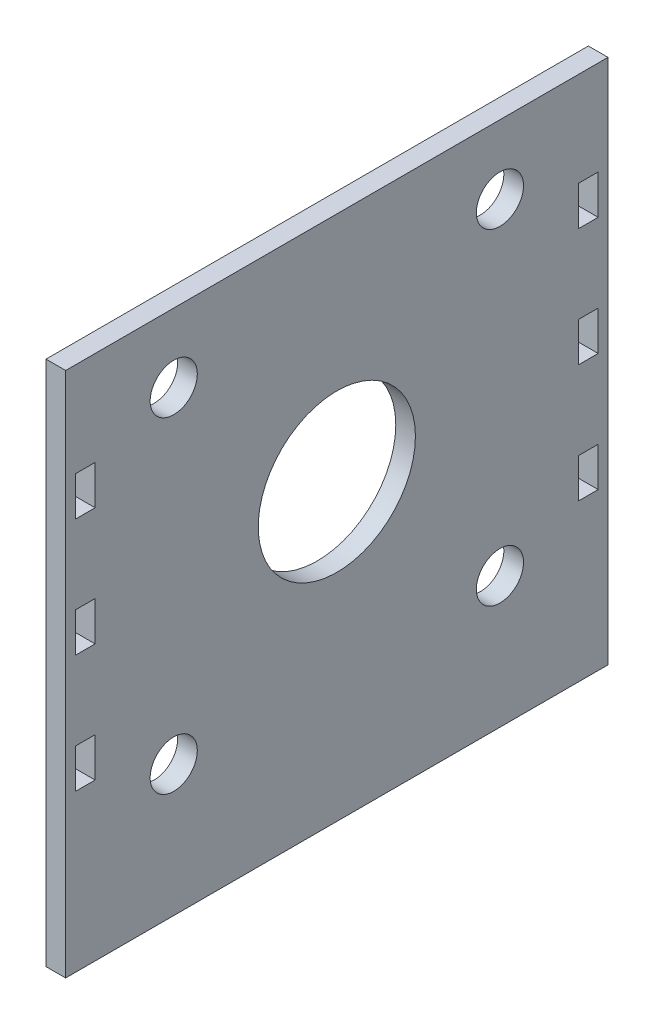
ISO-10303-21;
HEADER;
FILE_DESCRIPTION(('STEP AP214'),'2;1');
FILE_NAME('part.step','',(''),(''),'','','');
FILE_SCHEMA(('AUTOMOTIVE_DESIGN { 1 0 10303 214 1 1 1 1 }'));
ENDSEC;
DATA;
#1=APPLICATION_CONTEXT('core data for automotive mechanical design processes');
#2=APPLICATION_PROTOCOL_DEFINITION('international standard','automotive_design',2000,#1);
#3=PRODUCT_CONTEXT('',#1,'mechanical');
#4=PRODUCT('Part','Part','',(#3));
#5=PRODUCT_RELATED_PRODUCT_CATEGORY('part','',(#4));
#6=PRODUCT_DEFINITION_FORMATION('','',#4);
#7=PRODUCT_DEFINITION_CONTEXT('part definition',#1,'design');
#8=PRODUCT_DEFINITION('design','',#6,#7);
#9=PRODUCT_DEFINITION_SHAPE('','',#8);
#10=(LENGTH_UNIT() NAMED_UNIT(*) SI_UNIT(.MILLI.,.METRE.));
#11=(NAMED_UNIT(*) PLANE_ANGLE_UNIT() SI_UNIT($,.RADIAN.));
#12=(NAMED_UNIT(*) SI_UNIT($,.STERADIAN.) SOLID_ANGLE_UNIT());
#13=UNCERTAINTY_MEASURE_WITH_UNIT(LENGTH_MEASURE(1.E-05),#10,'distance_accuracy_value','');
#14=(GEOMETRIC_REPRESENTATION_CONTEXT(3) GLOBAL_UNCERTAINTY_ASSIGNED_CONTEXT((#13)) GLOBAL_UNIT_ASSIGNED_CONTEXT((#10,
#11,#12)) REPRESENTATION_CONTEXT('',''));
#15=CARTESIAN_POINT('',(0.,0.,0.));
#16=DIRECTION('',(0.,0.,1.));
#17=DIRECTION('',(1.,0.,0.));
#18=AXIS2_PLACEMENT_3D('',#15,#16,#17);
#19=CARTESIAN_POINT('',(5.,-74.875,0.));
#20=DIRECTION('',(0.,1.,0.));
#21=DIRECTION('',(0.,0.,1.));
#22=AXIS2_PLACEMENT_3D('',#19,#20,#21);
#23=PLANE('',#22);
#24=DIRECTION('',(0.,0.,-1.));
#25=VECTOR('',#24,1.);
#26=CARTESIAN_POINT('',(0.,-74.875,0.));
#27=LINE('',#26,#25);
#28=CARTESIAN_POINT('',(0.,-74.875,69.));
#29=VERTEX_POINT('',#28);
#30=CARTESIAN_POINT('',(0.,-74.875,-69.));
#31=VERTEX_POINT('',#30);
#32=EDGE_CURVE('E343',#29,#31,#27,.T.);
#33=ORIENTED_EDGE('',*,*,#32,.T.);
#34=DIRECTION('',(-1.,0.,0.));
#35=VECTOR('',#34,1.);
#36=CARTESIAN_POINT('',(5.,-74.875,-69.));
#37=LINE('',#36,#35);
#38=CARTESIAN_POINT('',(5.,-74.875,-69.));
#39=VERTEX_POINT('',#38);
#40=EDGE_CURVE('E11',#39,#31,#37,.T.);
#41=ORIENTED_EDGE('',*,*,#40,.F.);
#42=DIRECTION('',(0.,0.,-1.));
#43=VECTOR('',#42,1.);
#44=CARTESIAN_POINT('',(5.,-74.875,0.));
#45=LINE('',#44,#43);
#46=CARTESIAN_POINT('',(5.,-74.875,69.));
#47=VERTEX_POINT('',#46);
#48=EDGE_CURVE('E239',#47,#39,#45,.T.);
#49=ORIENTED_EDGE('',*,*,#48,.F.);
#50=DIRECTION('',(-1.,0.,0.));
#51=VECTOR('',#50,1.);
#52=CARTESIAN_POINT('',(5.,-74.875,69.));
#53=LINE('',#52,#51);
#54=EDGE_CURVE('E351',#47,#29,#53,.T.);
#55=ORIENTED_EDGE('',*,*,#54,.T.);
#56=EDGE_LOOP('',(#33,#41,#49,#55));
#57=FACE_BOUND('',#56,.T.);
#58=ADVANCED_FACE('F41',(#57),#23,.F.);
#59=CARTESIAN_POINT('',(5.,0.,-69.));
#60=DIRECTION('',(0.,0.,1.));
#61=DIRECTION('',(1.,0.,0.));
#62=AXIS2_PLACEMENT_3D('',#59,#60,#61);
#63=PLANE('',#62);
#64=DIRECTION('',(0.,1.,0.));
#65=VECTOR('',#64,1.);
#66=CARTESIAN_POINT('',(0.,0.,-69.));
#67=LINE('',#66,#65);
#68=CARTESIAN_POINT('',(0.,59.,-69.));
#69=VERTEX_POINT('',#68);
#70=EDGE_CURVE('E245',#31,#69,#67,.T.);
#71=ORIENTED_EDGE('',*,*,#70,.T.);
#72=DIRECTION('',(-1.,0.,0.));
#73=VECTOR('',#72,1.);
#74=CARTESIAN_POINT('',(5.,59.,-69.));
#75=LINE('',#74,#73);
#76=CARTESIAN_POINT('',(5.,59.,-69.));
#77=VERTEX_POINT('',#76);
#78=EDGE_CURVE('E51',#77,#69,#75,.T.);
#79=ORIENTED_EDGE('',*,*,#78,.F.);
#80=DIRECTION('',(0.,1.,0.));
#81=VECTOR('',#80,1.);
#82=CARTESIAN_POINT('',(5.,0.,-69.));
#83=LINE('',#82,#81);
#84=EDGE_CURVE('E233',#39,#77,#83,.T.);
#85=ORIENTED_EDGE('',*,*,#84,.F.);
#86=ORIENTED_EDGE('',*,*,#40,.T.);
#87=EDGE_LOOP('',(#71,#79,#85,#86));
#88=FACE_BOUND('',#87,.T.);
#89=ADVANCED_FACE('F244',(#88),#63,.F.);
#90=CARTESIAN_POINT('',(5.,59.0000000000001,0.));
#91=DIRECTION('',(0.,1.,0.));
#92=DIRECTION('',(0.,0.,1.));
#93=AXIS2_PLACEMENT_3D('',#90,#91,#92);
#94=PLANE('',#93);
#95=DIRECTION('',(0.,0.,-1.));
#96=VECTOR('',#95,1.);
#97=CARTESIAN_POINT('',(0.,59.0000000000001,0.));
#98=LINE('',#97,#96);
#99=CARTESIAN_POINT('',(0.,59.,69.));
#100=VERTEX_POINT('',#99);
#101=EDGE_CURVE('E347',#100,#69,#98,.T.);
#102=ORIENTED_EDGE('',*,*,#101,.F.);
#103=DIRECTION('',(-1.,0.,0.));
#104=VECTOR('',#103,1.);
#105=CARTESIAN_POINT('',(5.,59.,69.));
#106=LINE('',#105,#104);
#107=CARTESIAN_POINT('',(5.,59.,69.));
#108=VERTEX_POINT('',#107);
#109=EDGE_CURVE('E148',#108,#100,#106,.T.);
#110=ORIENTED_EDGE('',*,*,#109,.F.);
#111=DIRECTION('',(0.,0.,-1.));
#112=VECTOR('',#111,1.);
#113=CARTESIAN_POINT('',(5.,59.0000000000001,0.));
#114=LINE('',#113,#112);
#115=EDGE_CURVE('E237',#108,#77,#114,.T.);
#116=ORIENTED_EDGE('',*,*,#115,.T.);
#117=ORIENTED_EDGE('',*,*,#78,.T.);
#118=EDGE_LOOP('',(#102,#110,#116,#117));
#119=FACE_BOUND('',#118,.T.);
#120=ADVANCED_FACE('F250',(#119),#94,.T.);
#121=CARTESIAN_POINT('',(5.,0.,-61.5));
#122=DIRECTION('',(0.,0.,-1.));
#123=DIRECTION('',(-1.,0.,0.));
#124=AXIS2_PLACEMENT_3D('',#121,#122,#123);
#125=PLANE('',#124);
#126=DIRECTION('',(0.,-1.,0.));
#127=VECTOR('',#126,1.);
#128=CARTESIAN_POINT('',(0.,0.,-61.5));
#129=LINE('',#128,#127);
#130=CARTESIAN_POINT('',(0.,4.99973746629868,-61.5));
#131=VERTEX_POINT('',#130);
#132=CARTESIAN_POINT('',(0.,-4.99973746629867,-61.5));
#133=VERTEX_POINT('',#132);
#134=EDGE_CURVE('E331',#131,#133,#129,.T.);
#135=ORIENTED_EDGE('',*,*,#134,.F.);
#136=DIRECTION('',(-1.,0.,0.));
#137=VECTOR('',#136,1.);
#138=CARTESIAN_POINT('',(5.,4.99973746629868,-61.5));
#139=LINE('',#138,#137);
#140=CARTESIAN_POINT('',(5.,4.99973746629868,-61.5));
#141=VERTEX_POINT('',#140);
#142=EDGE_CURVE('E353',#141,#131,#139,.T.);
#143=ORIENTED_EDGE('',*,*,#142,.F.);
#144=DIRECTION('',(0.,-1.,0.));
#145=VECTOR('',#144,1.);
#146=CARTESIAN_POINT('',(5.,0.,-61.5));
#147=LINE('',#146,#145);
#148=CARTESIAN_POINT('',(5.,-4.99973746629867,-61.5));
#149=VERTEX_POINT('',#148);
#150=EDGE_CURVE('E827',#141,#149,#147,.T.);
#151=ORIENTED_EDGE('',*,*,#150,.T.);
#152=DIRECTION('',(-1.,0.,0.));
#153=VECTOR('',#152,1.);
#154=CARTESIAN_POINT('',(5.,-4.99973746629867,-61.5));
#155=LINE('',#154,#153);
#156=EDGE_CURVE('E355',#149,#133,#155,.T.);
#157=ORIENTED_EDGE('',*,*,#156,.T.);
#158=EDGE_LOOP('',(#135,#143,#151,#157));
#159=FACE_BOUND('',#158,.T.);
#160=ADVANCED_FACE('F451',(#159),#125,.T.);
#161=CARTESIAN_POINT('',(5.,4.99973746629868,0.));
#162=DIRECTION('',(0.,-1.,0.));
#163=DIRECTION('',(0.,0.,-1.));
#164=AXIS2_PLACEMENT_3D('',#161,#162,#163);
#165=PLANE('',#164);
#166=DIRECTION('',(0.,0.,1.));
#167=VECTOR('',#166,1.);
#168=CARTESIAN_POINT('',(0.,4.99973746629868,0.));
#169=LINE('',#168,#167);
#170=CARTESIAN_POINT('',(0.,4.99973746629868,-66.5));
#171=VERTEX_POINT('',#170);
#172=EDGE_CURVE('E334',#171,#131,#169,.T.);
#173=ORIENTED_EDGE('',*,*,#172,.F.);
#174=DIRECTION('',(-1.,0.,0.));
#175=VECTOR('',#174,1.);
#176=CARTESIAN_POINT('',(5.,4.99973746629868,-66.5));
#177=LINE('',#176,#175);
#178=CARTESIAN_POINT('',(5.,4.99973746629868,-66.5));
#179=VERTEX_POINT('',#178);
#180=EDGE_CURVE('E361',#179,#171,#177,.T.);
#181=ORIENTED_EDGE('',*,*,#180,.F.);
#182=DIRECTION('',(0.,0.,1.));
#183=VECTOR('',#182,1.);
#184=CARTESIAN_POINT('',(5.,4.99973746629868,0.));
#185=LINE('',#184,#183);
#186=EDGE_CURVE('E830',#179,#141,#185,.T.);
#187=ORIENTED_EDGE('',*,*,#186,.T.);
#188=ORIENTED_EDGE('',*,*,#142,.T.);
#189=EDGE_LOOP('',(#173,#181,#187,#188));
#190=FACE_BOUND('',#189,.T.);
#191=ADVANCED_FACE('F447',(#190),#165,.T.);
#192=CARTESIAN_POINT('',(5.,0.,-66.5));
#193=DIRECTION('',(0.,0.,-1.));
#194=DIRECTION('',(-1.,0.,0.));
#195=AXIS2_PLACEMENT_3D('',#192,#193,#194);
#196=PLANE('',#195);
#197=DIRECTION('',(0.,-1.,0.));
#198=VECTOR('',#197,1.);
#199=CARTESIAN_POINT('',(0.,0.,-66.5));
#200=LINE('',#199,#198);
#201=CARTESIAN_POINT('',(0.,-4.99973746629867,-66.5));
#202=VERTEX_POINT('',#201);
#203=EDGE_CURVE('E337',#171,#202,#200,.T.);
#204=ORIENTED_EDGE('',*,*,#203,.T.);
#205=DIRECTION('',(-1.,0.,0.));
#206=VECTOR('',#205,1.);
#207=CARTESIAN_POINT('',(5.,-4.99973746629867,-66.5));
#208=LINE('',#207,#206);
#209=CARTESIAN_POINT('',(5.,-4.99973746629867,-66.5));
#210=VERTEX_POINT('',#209);
#211=EDGE_CURVE('E357',#210,#202,#208,.T.);
#212=ORIENTED_EDGE('',*,*,#211,.F.);
#213=DIRECTION('',(0.,-1.,0.));
#214=VECTOR('',#213,1.);
#215=CARTESIAN_POINT('',(5.,0.,-66.5));
#216=LINE('',#215,#214);
#217=EDGE_CURVE('E838',#179,#210,#216,.T.);
#218=ORIENTED_EDGE('',*,*,#217,.F.);
#219=ORIENTED_EDGE('',*,*,#180,.T.);
#220=EDGE_LOOP('',(#204,#212,#218,#219));
#221=FACE_BOUND('',#220,.T.);
#222=ADVANCED_FACE('F443',(#221),#196,.F.);
#223=CARTESIAN_POINT('',(5.,0.,-61.5));
#224=DIRECTION('',(0.,0.,-1.));
#225=DIRECTION('',(0.,1.,0.));
#226=AXIS2_PLACEMENT_3D('',#223,#224,#225);
#227=PLANE('',#226);
#228=DIRECTION('',(0.,-1.,0.));
#229=VECTOR('',#228,1.);
#230=CARTESIAN_POINT('',(0.,0.,-61.5));
#231=LINE('',#230,#229);
#232=CARTESIAN_POINT('',(0.,34.9997374662987,-61.5));
#233=VERTEX_POINT('',#232);
#234=CARTESIAN_POINT('',(0.,25.0002625337013,-61.5));
#235=VERTEX_POINT('',#234);
#236=EDGE_CURVE('E319',#233,#235,#231,.T.);
#237=ORIENTED_EDGE('',*,*,#236,.F.);
#238=DIRECTION('',(-1.,0.,0.));
#239=VECTOR('',#238,1.);
#240=CARTESIAN_POINT('',(5.,34.9997374662987,-61.5));
#241=LINE('',#240,#239);
#242=CARTESIAN_POINT('',(5.,34.9997374662987,-61.5));
#243=VERTEX_POINT('',#242);
#244=EDGE_CURVE('E358',#243,#233,#241,.T.);
#245=ORIENTED_EDGE('',*,*,#244,.F.);
#246=DIRECTION('',(0.,-1.,0.));
#247=VECTOR('',#246,1.);
#248=CARTESIAN_POINT('',(5.,0.,-61.5));
#249=LINE('',#248,#247);
#250=CARTESIAN_POINT('',(5.,25.0002625337013,-61.5));
#251=VERTEX_POINT('',#250);
#252=EDGE_CURVE('E822',#243,#251,#249,.T.);
#253=ORIENTED_EDGE('',*,*,#252,.T.);
#254=DIRECTION('',(-1.,0.,0.));
#255=VECTOR('',#254,1.);
#256=CARTESIAN_POINT('',(5.,25.0002625337013,-61.5));
#257=LINE('',#256,#255);
#258=EDGE_CURVE('E364',#251,#235,#257,.T.);
#259=ORIENTED_EDGE('',*,*,#258,.T.);
#260=EDGE_LOOP('',(#237,#245,#253,#259));
#261=FACE_BOUND('',#260,.T.);
#262=ADVANCED_FACE('F446',(#261),#227,.T.);
#263=CARTESIAN_POINT('',(5.,34.9997374662987,0.));
#264=DIRECTION('',(0.,-1.,0.));
#265=DIRECTION('',(0.,0.,-1.));
#266=AXIS2_PLACEMENT_3D('',#263,#264,#265);
#267=PLANE('',#266);
#268=DIRECTION('',(0.,0.,1.));
#269=VECTOR('',#268,1.);
#270=CARTESIAN_POINT('',(0.,34.9997374662987,0.));
#271=LINE('',#270,#269);
#272=CARTESIAN_POINT('',(0.,34.9997374662987,-66.5));
#273=VERTEX_POINT('',#272);
#274=EDGE_CURVE('E322',#273,#233,#271,.T.);
#275=ORIENTED_EDGE('',*,*,#274,.F.);
#276=DIRECTION('',(-1.,0.,0.));
#277=VECTOR('',#276,1.);
#278=CARTESIAN_POINT('',(5.,34.9997374662987,-66.5));
#279=LINE('',#278,#277);
#280=CARTESIAN_POINT('',(5.,34.9997374662987,-66.5));
#281=VERTEX_POINT('',#280);
#282=EDGE_CURVE('E370',#281,#273,#279,.T.);
#283=ORIENTED_EDGE('',*,*,#282,.F.);
#284=DIRECTION('',(0.,0.,1.));
#285=VECTOR('',#284,1.);
#286=CARTESIAN_POINT('',(5.,34.9997374662987,0.));
#287=LINE('',#286,#285);
#288=EDGE_CURVE('E847',#281,#243,#287,.T.);
#289=ORIENTED_EDGE('',*,*,#288,.T.);
#290=ORIENTED_EDGE('',*,*,#244,.T.);
#291=EDGE_LOOP('',(#275,#283,#289,#290));
#292=FACE_BOUND('',#291,.T.);
#293=ADVANCED_FACE('F464',(#292),#267,.T.);
#294=CARTESIAN_POINT('',(5.,0.,-66.5));
#295=DIRECTION('',(0.,0.,-1.));
#296=DIRECTION('',(-1.,0.,0.));
#297=AXIS2_PLACEMENT_3D('',#294,#295,#296);
#298=PLANE('',#297);
#299=DIRECTION('',(0.,-1.,0.));
#300=VECTOR('',#299,1.);
#301=CARTESIAN_POINT('',(0.,0.,-66.5));
#302=LINE('',#301,#300);
#303=CARTESIAN_POINT('',(0.,25.0002625337013,-66.5));
#304=VERTEX_POINT('',#303);
#305=EDGE_CURVE('E325',#273,#304,#302,.T.);
#306=ORIENTED_EDGE('',*,*,#305,.T.);
#307=DIRECTION('',(-1.,0.,0.));
#308=VECTOR('',#307,1.);
#309=CARTESIAN_POINT('',(5.,25.0002625337013,-66.5));
#310=LINE('',#309,#308);
#311=CARTESIAN_POINT('',(5.,25.0002625337013,-66.5));
#312=VERTEX_POINT('',#311);
#313=EDGE_CURVE('E366',#312,#304,#310,.T.);
#314=ORIENTED_EDGE('',*,*,#313,.F.);
#315=DIRECTION('',(0.,-1.,0.));
#316=VECTOR('',#315,1.);
#317=CARTESIAN_POINT('',(5.,0.,-66.5));
#318=LINE('',#317,#316);
#319=EDGE_CURVE('E844',#281,#312,#318,.T.);
#320=ORIENTED_EDGE('',*,*,#319,.F.);
#321=ORIENTED_EDGE('',*,*,#282,.T.);
#322=EDGE_LOOP('',(#306,#314,#320,#321));
#323=FACE_BOUND('',#322,.T.);
#324=ADVANCED_FACE('F460',(#323),#298,.F.);
#325=CARTESIAN_POINT('',(5.,4.99973746629868,0.));
#326=DIRECTION('',(0.,1.,0.));
#327=DIRECTION('',(0.,0.,1.));
#328=AXIS2_PLACEMENT_3D('',#325,#326,#327);
#329=PLANE('',#328);
#330=DIRECTION('',(0.,0.,-1.));
#331=VECTOR('',#330,1.);
#332=CARTESIAN_POINT('',(0.,4.99973746629868,0.));
#333=LINE('',#332,#331);
#334=CARTESIAN_POINT('',(0.,4.99973746629868,66.5));
#335=VERTEX_POINT('',#334);
#336=CARTESIAN_POINT('',(0.,4.99973746629868,61.5));
#337=VERTEX_POINT('',#336);
#338=EDGE_CURVE('E307',#335,#337,#333,.T.);
#339=ORIENTED_EDGE('',*,*,#338,.T.);
#340=DIRECTION('',(-1.,0.,0.));
#341=VECTOR('',#340,1.);
#342=CARTESIAN_POINT('',(5.,4.99973746629868,61.5));
#343=LINE('',#342,#341);
#344=CARTESIAN_POINT('',(5.,4.99973746629868,61.5));
#345=VERTEX_POINT('',#344);
#346=EDGE_CURVE('E367',#345,#337,#343,.T.);
#347=ORIENTED_EDGE('',*,*,#346,.F.);
#348=DIRECTION('',(0.,0.,-1.));
#349=VECTOR('',#348,1.);
#350=CARTESIAN_POINT('',(5.,4.99973746629868,0.));
#351=LINE('',#350,#349);
#352=CARTESIAN_POINT('',(5.,4.99973746629868,66.5));
#353=VERTEX_POINT('',#352);
#354=EDGE_CURVE('E816',#353,#345,#351,.T.);
#355=ORIENTED_EDGE('',*,*,#354,.F.);
#356=DIRECTION('',(-1.,0.,0.));
#357=VECTOR('',#356,1.);
#358=CARTESIAN_POINT('',(5.,4.99973746629868,66.5));
#359=LINE('',#358,#357);
#360=EDGE_CURVE('E373',#353,#335,#359,.T.);
#361=ORIENTED_EDGE('',*,*,#360,.T.);
#362=EDGE_LOOP('',(#339,#347,#355,#361));
#363=FACE_BOUND('',#362,.T.);
#364=ADVANCED_FACE('F463',(#363),#329,.F.);
#365=CARTESIAN_POINT('',(5.,0.,61.5));
#366=DIRECTION('',(0.,0.,-1.));
#367=DIRECTION('',(-1.,0.,0.));
#368=AXIS2_PLACEMENT_3D('',#365,#366,#367);
#369=PLANE('',#368);
#370=DIRECTION('',(0.,-1.,0.));
#371=VECTOR('',#370,1.);
#372=CARTESIAN_POINT('',(0.,0.,61.5));
#373=LINE('',#372,#371);
#374=CARTESIAN_POINT('',(0.,-4.99973746629867,61.5));
#375=VERTEX_POINT('',#374);
#376=EDGE_CURVE('E310',#337,#375,#373,.T.);
#377=ORIENTED_EDGE('',*,*,#376,.T.);
#378=DIRECTION('',(-1.,0.,0.));
#379=VECTOR('',#378,1.);
#380=CARTESIAN_POINT('',(5.,-4.99973746629867,61.5));
#381=LINE('',#380,#379);
#382=CARTESIAN_POINT('',(5.,-4.99973746629867,61.5));
#383=VERTEX_POINT('',#382);
#384=EDGE_CURVE('E378',#383,#375,#381,.T.);
#385=ORIENTED_EDGE('',*,*,#384,.F.);
#386=DIRECTION('',(0.,-1.,0.));
#387=VECTOR('',#386,1.);
#388=CARTESIAN_POINT('',(5.,0.,61.5));
#389=LINE('',#388,#387);
#390=EDGE_CURVE('E856',#345,#383,#389,.T.);
#391=ORIENTED_EDGE('',*,*,#390,.F.);
#392=ORIENTED_EDGE('',*,*,#346,.T.);
#393=EDGE_LOOP('',(#377,#385,#391,#392));
#394=FACE_BOUND('',#393,.T.);
#395=ADVANCED_FACE('F480',(#394),#369,.F.);
#396=CARTESIAN_POINT('',(5.,-4.99973746629867,0.));
#397=DIRECTION('',(0.,1.,0.));
#398=DIRECTION('',(0.,0.,1.));
#399=AXIS2_PLACEMENT_3D('',#396,#397,#398);
#400=PLANE('',#399);
#401=DIRECTION('',(0.,0.,-1.));
#402=VECTOR('',#401,1.);
#403=CARTESIAN_POINT('',(0.,-4.99973746629867,0.));
#404=LINE('',#403,#402);
#405=CARTESIAN_POINT('',(0.,-4.99973746629867,66.5));
#406=VERTEX_POINT('',#405);
#407=EDGE_CURVE('E313',#406,#375,#404,.T.);
#408=ORIENTED_EDGE('',*,*,#407,.F.);
#409=DIRECTION('',(-1.,0.,0.));
#410=VECTOR('',#409,1.);
#411=CARTESIAN_POINT('',(5.,-4.99973746629867,66.5));
#412=LINE('',#411,#410);
#413=CARTESIAN_POINT('',(5.,-4.99973746629867,66.5));
#414=VERTEX_POINT('',#413);
#415=EDGE_CURVE('E375',#414,#406,#412,.T.);
#416=ORIENTED_EDGE('',*,*,#415,.F.);
#417=DIRECTION('',(0.,0.,-1.));
#418=VECTOR('',#417,1.);
#419=CARTESIAN_POINT('',(5.,-4.99973746629867,0.));
#420=LINE('',#419,#418);
#421=EDGE_CURVE('E853',#414,#383,#420,.T.);
#422=ORIENTED_EDGE('',*,*,#421,.T.);
#423=ORIENTED_EDGE('',*,*,#384,.T.);
#424=EDGE_LOOP('',(#408,#416,#422,#423));
#425=FACE_BOUND('',#424,.T.);
#426=ADVANCED_FACE('F476',(#425),#400,.T.);
#427=CARTESIAN_POINT('',(5.,34.9997374662987,0.));
#428=DIRECTION('',(0.,1.,0.));
#429=DIRECTION('',(0.,0.,1.));
#430=AXIS2_PLACEMENT_3D('',#427,#428,#429);
#431=PLANE('',#430);
#432=DIRECTION('',(0.,0.,-1.));
#433=VECTOR('',#432,1.);
#434=CARTESIAN_POINT('',(0.,34.9997374662987,0.));
#435=LINE('',#434,#433);
#436=CARTESIAN_POINT('',(0.,34.9997374662987,66.5));
#437=VERTEX_POINT('',#436);
#438=CARTESIAN_POINT('',(0.,34.9997374662987,61.5));
#439=VERTEX_POINT('',#438);
#440=EDGE_CURVE('E295',#437,#439,#435,.T.);
#441=ORIENTED_EDGE('',*,*,#440,.T.);
#442=DIRECTION('',(-1.,0.,0.));
#443=VECTOR('',#442,1.);
#444=CARTESIAN_POINT('',(5.,34.9997374662987,61.5));
#445=LINE('',#444,#443);
#446=CARTESIAN_POINT('',(5.,34.9997374662987,61.5));
#447=VERTEX_POINT('',#446);
#448=EDGE_CURVE('E376',#447,#439,#445,.T.);
#449=ORIENTED_EDGE('',*,*,#448,.F.);
#450=DIRECTION('',(0.,0.,-1.));
#451=VECTOR('',#450,1.);
#452=CARTESIAN_POINT('',(5.,34.9997374662987,0.));
#453=LINE('',#452,#451);
#454=CARTESIAN_POINT('',(5.,34.9997374662987,66.5));
#455=VERTEX_POINT('',#454);
#456=EDGE_CURVE('E810',#455,#447,#453,.T.);
#457=ORIENTED_EDGE('',*,*,#456,.F.);
#458=DIRECTION('',(-1.,0.,0.));
#459=VECTOR('',#458,1.);
#460=CARTESIAN_POINT('',(5.,34.9997374662987,66.5));
#461=LINE('',#460,#459);
#462=EDGE_CURVE('E382',#455,#437,#461,.T.);
#463=ORIENTED_EDGE('',*,*,#462,.T.);
#464=EDGE_LOOP('',(#441,#449,#457,#463));
#465=FACE_BOUND('',#464,.T.);
#466=ADVANCED_FACE('F479',(#465),#431,.F.);
#467=CARTESIAN_POINT('',(5.,0.,61.5));
#468=DIRECTION('',(0.,0.,-1.));
#469=DIRECTION('',(0.,1.,0.));
#470=AXIS2_PLACEMENT_3D('',#467,#468,#469);
#471=PLANE('',#470);
#472=DIRECTION('',(0.,-1.,0.));
#473=VECTOR('',#472,1.);
#474=CARTESIAN_POINT('',(0.,0.,61.5));
#475=LINE('',#474,#473);
#476=CARTESIAN_POINT('',(0.,25.0002625337013,61.5));
#477=VERTEX_POINT('',#476);
#478=EDGE_CURVE('E298',#439,#477,#475,.T.);
#479=ORIENTED_EDGE('',*,*,#478,.T.);
#480=DIRECTION('',(-1.,0.,0.));
#481=VECTOR('',#480,1.);
#482=CARTESIAN_POINT('',(5.,25.0002625337013,61.5));
#483=LINE('',#482,#481);
#484=CARTESIAN_POINT('',(5.,25.0002625337013,61.5));
#485=VERTEX_POINT('',#484);
#486=EDGE_CURVE('E387',#485,#477,#483,.T.);
#487=ORIENTED_EDGE('',*,*,#486,.F.);
#488=DIRECTION('',(0.,-1.,0.));
#489=VECTOR('',#488,1.);
#490=CARTESIAN_POINT('',(5.,0.,61.5));
#491=LINE('',#490,#489);
#492=EDGE_CURVE('E865',#447,#485,#491,.T.);
#493=ORIENTED_EDGE('',*,*,#492,.F.);
#494=ORIENTED_EDGE('',*,*,#448,.T.);
#495=EDGE_LOOP('',(#479,#487,#493,#494));
#496=FACE_BOUND('',#495,.T.);
#497=ADVANCED_FACE('F496',(#496),#471,.F.);
#498=CARTESIAN_POINT('',(5.,25.0002625337013,0.));
#499=DIRECTION('',(0.,1.,0.));
#500=DIRECTION('',(0.,0.,1.));
#501=AXIS2_PLACEMENT_3D('',#498,#499,#500);
#502=PLANE('',#501);
#503=DIRECTION('',(0.,0.,-1.));
#504=VECTOR('',#503,1.);
#505=CARTESIAN_POINT('',(0.,25.0002625337013,0.));
#506=LINE('',#505,#504);
#507=CARTESIAN_POINT('',(0.,25.0002625337013,66.5));
#508=VERTEX_POINT('',#507);
#509=EDGE_CURVE('E301',#508,#477,#506,.T.);
#510=ORIENTED_EDGE('',*,*,#509,.F.);
#511=DIRECTION('',(-1.,0.,0.));
#512=VECTOR('',#511,1.);
#513=CARTESIAN_POINT('',(5.,25.0002625337013,66.5));
#514=LINE('',#513,#512);
#515=CARTESIAN_POINT('',(5.,25.0002625337013,66.5));
#516=VERTEX_POINT('',#515);
#517=EDGE_CURVE('E384',#516,#508,#514,.T.);
#518=ORIENTED_EDGE('',*,*,#517,.F.);
#519=DIRECTION('',(0.,0.,-1.));
#520=VECTOR('',#519,1.);
#521=CARTESIAN_POINT('',(5.,25.0002625337013,0.));
#522=LINE('',#521,#520);
#523=EDGE_CURVE('E862',#516,#485,#522,.T.);
#524=ORIENTED_EDGE('',*,*,#523,.T.);
#525=ORIENTED_EDGE('',*,*,#486,.T.);
#526=EDGE_LOOP('',(#510,#518,#524,#525));
#527=FACE_BOUND('',#526,.T.);
#528=ADVANCED_FACE('F492',(#527),#502,.T.);
#529=CARTESIAN_POINT('',(5.,-25.0002625337013,0.));
#530=DIRECTION('',(0.,1.,0.));
#531=DIRECTION('',(0.,0.,1.));
#532=AXIS2_PLACEMENT_3D('',#529,#530,#531);
#533=PLANE('',#532);
#534=DIRECTION('',(0.,0.,-1.));
#535=VECTOR('',#534,1.);
#536=CARTESIAN_POINT('',(0.,-25.0002625337013,0.));
#537=LINE('',#536,#535);
#538=CARTESIAN_POINT('',(0.,-25.0002625337013,66.5));
#539=VERTEX_POINT('',#538);
#540=CARTESIAN_POINT('',(0.,-25.0002625337013,61.5));
#541=VERTEX_POINT('',#540);
#542=EDGE_CURVE('E283',#539,#541,#537,.T.);
#543=ORIENTED_EDGE('',*,*,#542,.T.);
#544=DIRECTION('',(-1.,0.,0.));
#545=VECTOR('',#544,1.);
#546=CARTESIAN_POINT('',(5.,-25.0002625337013,61.5));
#547=LINE('',#546,#545);
#548=CARTESIAN_POINT('',(5.,-25.0002625337013,61.5));
#549=VERTEX_POINT('',#548);
#550=EDGE_CURVE('E385',#549,#541,#547,.T.);
#551=ORIENTED_EDGE('',*,*,#550,.F.);
#552=DIRECTION('',(0.,0.,-1.));
#553=VECTOR('',#552,1.);
#554=CARTESIAN_POINT('',(5.,-25.0002625337013,0.));
#555=LINE('',#554,#553);
#556=CARTESIAN_POINT('',(5.,-25.0002625337013,66.5));
#557=VERTEX_POINT('',#556);
#558=EDGE_CURVE('E804',#557,#549,#555,.T.);
#559=ORIENTED_EDGE('',*,*,#558,.F.);
#560=DIRECTION('',(-1.,0.,0.));
#561=VECTOR('',#560,1.);
#562=CARTESIAN_POINT('',(5.,-25.0002625337013,66.5));
#563=LINE('',#562,#561);
#564=EDGE_CURVE('E391',#557,#539,#563,.T.);
#565=ORIENTED_EDGE('',*,*,#564,.T.);
#566=EDGE_LOOP('',(#543,#551,#559,#565));
#567=FACE_BOUND('',#566,.T.);
#568=ADVANCED_FACE('F495',(#567),#533,.F.);
#569=CARTESIAN_POINT('',(5.,0.,61.5));
#570=DIRECTION('',(0.,0.,-1.));
#571=DIRECTION('',(0.,1.,0.));
#572=AXIS2_PLACEMENT_3D('',#569,#570,#571);
#573=PLANE('',#572);
#574=DIRECTION('',(0.,-1.,0.));
#575=VECTOR('',#574,1.);
#576=CARTESIAN_POINT('',(0.,0.,61.5));
#577=LINE('',#576,#575);
#578=CARTESIAN_POINT('',(0.,-34.9997374662987,61.5));
#579=VERTEX_POINT('',#578);
#580=EDGE_CURVE('E286',#541,#579,#577,.T.);
#581=ORIENTED_EDGE('',*,*,#580,.T.);
#582=DIRECTION('',(-1.,0.,0.));
#583=VECTOR('',#582,1.);
#584=CARTESIAN_POINT('',(5.,-34.9997374662987,61.5));
#585=LINE('',#584,#583);
#586=CARTESIAN_POINT('',(5.,-34.9997374662987,61.5));
#587=VERTEX_POINT('',#586);
#588=EDGE_CURVE('E395',#587,#579,#585,.T.);
#589=ORIENTED_EDGE('',*,*,#588,.F.);
#590=DIRECTION('',(0.,-1.,0.));
#591=VECTOR('',#590,1.);
#592=CARTESIAN_POINT('',(5.,0.,61.5));
#593=LINE('',#592,#591);
#594=EDGE_CURVE('E874',#549,#587,#593,.T.);
#595=ORIENTED_EDGE('',*,*,#594,.F.);
#596=ORIENTED_EDGE('',*,*,#550,.T.);
#597=EDGE_LOOP('',(#581,#589,#595,#596));
#598=FACE_BOUND('',#597,.T.);
#599=ADVANCED_FACE('F510',(#598),#573,.F.);
#600=CARTESIAN_POINT('',(5.,-34.9997374662987,0.));
#601=DIRECTION('',(0.,1.,0.));
#602=DIRECTION('',(0.,0.,1.));
#603=AXIS2_PLACEMENT_3D('',#600,#601,#602);
#604=PLANE('',#603);
#605=DIRECTION('',(0.,0.,-1.));
#606=VECTOR('',#605,1.);
#607=CARTESIAN_POINT('',(0.,-34.9997374662987,0.));
#608=LINE('',#607,#606);
#609=CARTESIAN_POINT('',(0.,-34.9997374662987,66.5));
#610=VERTEX_POINT('',#609);
#611=EDGE_CURVE('E289',#610,#579,#608,.T.);
#612=ORIENTED_EDGE('',*,*,#611,.F.);
#613=DIRECTION('',(-1.,0.,0.));
#614=VECTOR('',#613,1.);
#615=CARTESIAN_POINT('',(5.,-34.9997374662987,66.5));
#616=LINE('',#615,#614);
#617=CARTESIAN_POINT('',(5.,-34.9997374662987,66.5));
#618=VERTEX_POINT('',#617);
#619=EDGE_CURVE('E393',#618,#610,#616,.T.);
#620=ORIENTED_EDGE('',*,*,#619,.F.);
#621=DIRECTION('',(0.,0.,-1.));
#622=VECTOR('',#621,1.);
#623=CARTESIAN_POINT('',(5.,-34.9997374662987,0.));
#624=LINE('',#623,#622);
#625=EDGE_CURVE('E871',#618,#587,#624,.T.);
#626=ORIENTED_EDGE('',*,*,#625,.T.);
#627=ORIENTED_EDGE('',*,*,#588,.T.);
#628=EDGE_LOOP('',(#612,#620,#626,#627));
#629=FACE_BOUND('',#628,.T.);
#630=ADVANCED_FACE('F507',(#629),#604,.T.);
#631=CARTESIAN_POINT('',(5.,0.,-66.5));
#632=DIRECTION('',(0.,0.,-1.));
#633=DIRECTION('',(-1.,0.,0.));
#634=AXIS2_PLACEMENT_3D('',#631,#632,#633);
#635=PLANE('',#634);
#636=DIRECTION('',(0.,-1.,0.));
#637=VECTOR('',#636,1.);
#638=CARTESIAN_POINT('',(0.,0.,-66.5));
#639=LINE('',#638,#637);
#640=CARTESIAN_POINT('',(0.,-25.0002625337013,-66.5));
#641=VERTEX_POINT('',#640);
#642=CARTESIAN_POINT('',(0.,-34.9997374662987,-66.5));
#643=VERTEX_POINT('',#642);
#644=EDGE_CURVE('E271',#641,#643,#639,.T.);
#645=ORIENTED_EDGE('',*,*,#644,.T.);
#646=DIRECTION('',(-1.,0.,0.));
#647=VECTOR('',#646,1.);
#648=CARTESIAN_POINT('',(5.,-34.9997374662987,-66.5));
#649=LINE('',#648,#647);
#650=CARTESIAN_POINT('',(5.,-34.9997374662987,-66.5));
#651=VERTEX_POINT('',#650);
#652=EDGE_CURVE('E45',#651,#643,#649,.T.);
#653=ORIENTED_EDGE('',*,*,#652,.F.);
#654=DIRECTION('',(0.,-1.,0.));
#655=VECTOR('',#654,1.);
#656=CARTESIAN_POINT('',(5.,0.,-66.5));
#657=LINE('',#656,#655);
#658=CARTESIAN_POINT('',(5.,-25.0002625337013,-66.5));
#659=VERTEX_POINT('',#658);
#660=EDGE_CURVE('E799',#659,#651,#657,.T.);
#661=ORIENTED_EDGE('',*,*,#660,.F.);
#662=DIRECTION('',(-1.,0.,0.));
#663=VECTOR('',#662,1.);
#664=CARTESIAN_POINT('',(5.,-25.0002625337013,-66.5));
#665=LINE('',#664,#663);
#666=EDGE_CURVE('E252',#659,#641,#665,.T.);
#667=ORIENTED_EDGE('',*,*,#666,.T.);
#668=EDGE_LOOP('',(#645,#653,#661,#667));
#669=FACE_BOUND('',#668,.T.);
#670=ADVANCED_FACE('F410',(#669),#635,.F.);
#671=CARTESIAN_POINT('',(5.,-34.9997374662987,0.));
#672=DIRECTION('',(0.,-1.,0.));
#673=DIRECTION('',(0.,0.,-1.));
#674=AXIS2_PLACEMENT_3D('',#671,#672,#673);
#675=PLANE('',#674);
#676=DIRECTION('',(0.,0.,1.));
#677=VECTOR('',#676,1.);
#678=CARTESIAN_POINT('',(0.,-34.9997374662987,0.));
#679=LINE('',#678,#677);
#680=CARTESIAN_POINT('',(0.,-34.9997374662987,-61.5));
#681=VERTEX_POINT('',#680);
#682=EDGE_CURVE('E274',#643,#681,#679,.T.);
#683=ORIENTED_EDGE('',*,*,#682,.T.);
#684=DIRECTION('',(-1.,0.,0.));
#685=VECTOR('',#684,1.);
#686=CARTESIAN_POINT('',(5.,-34.9997374662987,-61.5));
#687=LINE('',#686,#685);
#688=CARTESIAN_POINT('',(5.,-34.9997374662987,-61.5));
#689=VERTEX_POINT('',#688);
#690=EDGE_CURVE('E401',#689,#681,#687,.T.);
#691=ORIENTED_EDGE('',*,*,#690,.F.);
#692=DIRECTION('',(0.,0.,1.));
#693=VECTOR('',#692,1.);
#694=CARTESIAN_POINT('',(5.,-34.9997374662987,0.));
#695=LINE('',#694,#693);
#696=EDGE_CURVE('E160',#651,#689,#695,.T.);
#697=ORIENTED_EDGE('',*,*,#696,.F.);
#698=ORIENTED_EDGE('',*,*,#652,.T.);
#699=EDGE_LOOP('',(#683,#691,#697,#698));
#700=FACE_BOUND('',#699,.T.);
#701=ADVANCED_FACE('F406',(#700),#675,.F.);
#702=CARTESIAN_POINT('',(5.,0.,-61.5));
#703=DIRECTION('',(0.,0.,-1.));
#704=DIRECTION('',(0.,1.,0.));
#705=AXIS2_PLACEMENT_3D('',#702,#703,#704);
#706=PLANE('',#705);
#707=DIRECTION('',(0.,-1.,0.));
#708=VECTOR('',#707,1.);
#709=CARTESIAN_POINT('',(0.,0.,-61.5));
#710=LINE('',#709,#708);
#711=CARTESIAN_POINT('',(0.,-25.0002625337013,-61.5));
#712=VERTEX_POINT('',#711);
#713=EDGE_CURVE('E277',#712,#681,#710,.T.);
#714=ORIENTED_EDGE('',*,*,#713,.F.);
#715=DIRECTION('',(-1.,0.,0.));
#716=VECTOR('',#715,1.);
#717=CARTESIAN_POINT('',(5.,-25.0002625337013,-61.5));
#718=LINE('',#717,#716);
#719=CARTESIAN_POINT('',(5.,-25.0002625337013,-61.5));
#720=VERTEX_POINT('',#719);
#721=EDGE_CURVE('E400',#720,#712,#718,.T.);
#722=ORIENTED_EDGE('',*,*,#721,.F.);
#723=DIRECTION('',(0.,-1.,0.));
#724=VECTOR('',#723,1.);
#725=CARTESIAN_POINT('',(5.,0.,-61.5));
#726=LINE('',#725,#724);
#727=EDGE_CURVE('E878',#720,#689,#726,.T.);
#728=ORIENTED_EDGE('',*,*,#727,.T.);
#729=ORIENTED_EDGE('',*,*,#690,.T.);
#730=EDGE_LOOP('',(#714,#722,#728,#729));
#731=FACE_BOUND('',#730,.T.);
#732=ADVANCED_FACE('F421',(#731),#706,.T.);
#733=CARTESIAN_POINT('',(5.,-4.99973746629867,0.));
#734=DIRECTION('',(0.,-1.,0.));
#735=DIRECTION('',(0.,0.,-1.));
#736=AXIS2_PLACEMENT_3D('',#733,#734,#735);
#737=PLANE('',#736);
#738=DIRECTION('',(0.,0.,1.));
#739=VECTOR('',#738,1.);
#740=CARTESIAN_POINT('',(0.,-4.99973746629867,0.));
#741=LINE('',#740,#739);
#742=EDGE_CURVE('E340',#202,#133,#741,.T.);
#743=ORIENTED_EDGE('',*,*,#742,.T.);
#744=ORIENTED_EDGE('',*,*,#156,.F.);
#745=DIRECTION('',(0.,0.,1.));
#746=VECTOR('',#745,1.);
#747=CARTESIAN_POINT('',(5.,-4.99973746629867,0.));
#748=LINE('',#747,#746);
#749=EDGE_CURVE('E831',#210,#149,#748,.T.);
#750=ORIENTED_EDGE('',*,*,#749,.F.);
#751=ORIENTED_EDGE('',*,*,#211,.T.);
#752=EDGE_LOOP('',(#743,#744,#750,#751));
#753=FACE_BOUND('',#752,.T.);
#754=ADVANCED_FACE('F423',(#753),#737,.F.);
#755=CARTESIAN_POINT('',(5.,25.0002625337013,0.));
#756=DIRECTION('',(0.,-1.,0.));
#757=DIRECTION('',(0.,0.,-1.));
#758=AXIS2_PLACEMENT_3D('',#755,#756,#757);
#759=PLANE('',#758);
#760=DIRECTION('',(0.,0.,1.));
#761=VECTOR('',#760,1.);
#762=CARTESIAN_POINT('',(0.,25.0002625337013,0.));
#763=LINE('',#762,#761);
#764=EDGE_CURVE('E328',#304,#235,#763,.T.);
#765=ORIENTED_EDGE('',*,*,#764,.T.);
#766=ORIENTED_EDGE('',*,*,#258,.F.);
#767=DIRECTION('',(0.,0.,1.));
#768=VECTOR('',#767,1.);
#769=CARTESIAN_POINT('',(5.,25.0002625337013,0.));
#770=LINE('',#769,#768);
#771=EDGE_CURVE('E833',#312,#251,#770,.T.);
#772=ORIENTED_EDGE('',*,*,#771,.F.);
#773=ORIENTED_EDGE('',*,*,#313,.T.);
#774=EDGE_LOOP('',(#765,#766,#772,#773));
#775=FACE_BOUND('',#774,.T.);
#776=ADVANCED_FACE('F429',(#775),#759,.F.);
#777=CARTESIAN_POINT('',(5.,0.,66.5));
#778=DIRECTION('',(0.,0.,-1.));
#779=DIRECTION('',(-1.,0.,0.));
#780=AXIS2_PLACEMENT_3D('',#777,#778,#779);
#781=PLANE('',#780);
#782=DIRECTION('',(0.,-1.,0.));
#783=VECTOR('',#782,1.);
#784=CARTESIAN_POINT('',(0.,0.,66.5));
#785=LINE('',#784,#783);
#786=EDGE_CURVE('E316',#335,#406,#785,.T.);
#787=ORIENTED_EDGE('',*,*,#786,.F.);
#788=ORIENTED_EDGE('',*,*,#360,.F.);
#789=DIRECTION('',(0.,-1.,0.));
#790=VECTOR('',#789,1.);
#791=CARTESIAN_POINT('',(5.,0.,66.5));
#792=LINE('',#791,#790);
#793=EDGE_CURVE('E850',#353,#414,#792,.T.);
#794=ORIENTED_EDGE('',*,*,#793,.T.);
#795=ORIENTED_EDGE('',*,*,#415,.T.);
#796=EDGE_LOOP('',(#787,#788,#794,#795));
#797=FACE_BOUND('',#796,.T.);
#798=ADVANCED_FACE('F458',(#797),#781,.T.);
#799=CARTESIAN_POINT('',(5.,0.,66.5));
#800=DIRECTION('',(0.,0.,-1.));
#801=DIRECTION('',(-1.,0.,0.));
#802=AXIS2_PLACEMENT_3D('',#799,#800,#801);
#803=PLANE('',#802);
#804=DIRECTION('',(0.,-1.,0.));
#805=VECTOR('',#804,1.);
#806=CARTESIAN_POINT('',(0.,0.,66.5));
#807=LINE('',#806,#805);
#808=EDGE_CURVE('E304',#437,#508,#807,.T.);
#809=ORIENTED_EDGE('',*,*,#808,.F.);
#810=ORIENTED_EDGE('',*,*,#462,.F.);
#811=DIRECTION('',(0.,-1.,0.));
#812=VECTOR('',#811,1.);
#813=CARTESIAN_POINT('',(5.,0.,66.5));
#814=LINE('',#813,#812);
#815=EDGE_CURVE('E859',#455,#516,#814,.T.);
#816=ORIENTED_EDGE('',*,*,#815,.T.);
#817=ORIENTED_EDGE('',*,*,#517,.T.);
#818=EDGE_LOOP('',(#809,#810,#816,#817));
#819=FACE_BOUND('',#818,.T.);
#820=ADVANCED_FACE('F474',(#819),#803,.T.);
#821=CARTESIAN_POINT('',(5.,0.,66.5));
#822=DIRECTION('',(0.,0.,-1.));
#823=DIRECTION('',(-1.,0.,0.));
#824=AXIS2_PLACEMENT_3D('',#821,#822,#823);
#825=PLANE('',#824);
#826=DIRECTION('',(0.,-1.,0.));
#827=VECTOR('',#826,1.);
#828=CARTESIAN_POINT('',(0.,0.,66.5));
#829=LINE('',#828,#827);
#830=EDGE_CURVE('E292',#539,#610,#829,.T.);
#831=ORIENTED_EDGE('',*,*,#830,.F.);
#832=ORIENTED_EDGE('',*,*,#564,.F.);
#833=DIRECTION('',(0.,-1.,0.));
#834=VECTOR('',#833,1.);
#835=CARTESIAN_POINT('',(5.,0.,66.5));
#836=LINE('',#835,#834);
#837=EDGE_CURVE('E868',#557,#618,#836,.T.);
#838=ORIENTED_EDGE('',*,*,#837,.T.);
#839=ORIENTED_EDGE('',*,*,#619,.T.);
#840=EDGE_LOOP('',(#831,#832,#838,#839));
#841=FACE_BOUND('',#840,.T.);
#842=ADVANCED_FACE('F490',(#841),#825,.T.);
#843=CARTESIAN_POINT('',(5.,-25.0002625337013,0.));
#844=DIRECTION('',(0.,-1.,0.));
#845=DIRECTION('',(0.,0.,-1.));
#846=AXIS2_PLACEMENT_3D('',#843,#844,#845);
#847=PLANE('',#846);
#848=DIRECTION('',(0.,0.,1.));
#849=VECTOR('',#848,1.);
#850=CARTESIAN_POINT('',(0.,-25.0002625337013,0.));
#851=LINE('',#850,#849);
#852=EDGE_CURVE('E280',#641,#712,#851,.T.);
#853=ORIENTED_EDGE('',*,*,#852,.F.);
#854=ORIENTED_EDGE('',*,*,#666,.F.);
#855=DIRECTION('',(0.,0.,1.));
#856=VECTOR('',#855,1.);
#857=CARTESIAN_POINT('',(5.,-25.0002625337013,0.));
#858=LINE('',#857,#856);
#859=EDGE_CURVE('E419',#659,#720,#858,.T.);
#860=ORIENTED_EDGE('',*,*,#859,.T.);
#861=ORIENTED_EDGE('',*,*,#721,.T.);
#862=EDGE_LOOP('',(#853,#854,#860,#861));
#863=FACE_BOUND('',#862,.T.);
#864=ADVANCED_FACE('F416',(#863),#847,.T.);
#865=CARTESIAN_POINT('',(5.,41.5,-41.5));
#866=DIRECTION('',(-1.,0.,0.));
#867=DIRECTION('',(0.,0.,1.));
#868=AXIS2_PLACEMENT_3D('',#865,#866,#867);
#869=CYLINDRICAL_SURFACE('',#868,6.);
#870=CARTESIAN_POINT('',(5.,41.5,-41.5));
#871=DIRECTION('',(1.,0.,0.));
#872=DIRECTION('',(0.,0.,-1.));
#873=AXIS2_PLACEMENT_3D('',#870,#871,#872);
#874=CIRCLE('',#873,6.);
#875=CARTESIAN_POINT('',(5.,41.5,-47.5));
#876=VERTEX_POINT('',#875);
#877=EDGE_CURVE('E797',#876,#876,#874,.T.);
#878=ORIENTED_EDGE('',*,*,#877,.T.);
#879=EDGE_LOOP('',(#878));
#880=FACE_BOUND('',#879,.T.);
#881=CARTESIAN_POINT('',(0.,41.5,-41.5));
#882=DIRECTION('',(1.,0.,0.));
#883=DIRECTION('',(0.,0.,-1.));
#884=AXIS2_PLACEMENT_3D('',#881,#882,#883);
#885=CIRCLE('',#884,6.);
#886=CARTESIAN_POINT('',(0.,41.5,-47.5));
#887=VERTEX_POINT('',#886);
#888=EDGE_CURVE('E268',#887,#887,#885,.T.);
#889=ORIENTED_EDGE('',*,*,#888,.F.);
#890=EDGE_LOOP('',(#889));
#891=FACE_BOUND('',#890,.T.);
#892=ADVANCED_FACE('F518',(#880,#891),#869,.F.);
#893=CARTESIAN_POINT('',(5.,-41.5,-41.5));
#894=DIRECTION('',(-1.,0.,0.));
#895=DIRECTION('',(0.,0.,1.));
#896=AXIS2_PLACEMENT_3D('',#893,#894,#895);
#897=CYLINDRICAL_SURFACE('',#896,6.);
#898=CARTESIAN_POINT('',(5.,-41.5,-41.5));
#899=DIRECTION('',(1.,0.,0.));
#900=DIRECTION('',(0.,0.,-1.));
#901=AXIS2_PLACEMENT_3D('',#898,#899,#900);
#902=CIRCLE('',#901,6.);
#903=CARTESIAN_POINT('',(5.,-41.5,-47.5));
#904=VERTEX_POINT('',#903);
#905=EDGE_CURVE('E794',#904,#904,#902,.T.);
#906=ORIENTED_EDGE('',*,*,#905,.T.);
#907=EDGE_LOOP('',(#906));
#908=FACE_BOUND('',#907,.T.);
#909=CARTESIAN_POINT('',(0.,-41.5,-41.5));
#910=DIRECTION('',(1.,0.,0.));
#911=DIRECTION('',(0.,0.,-1.));
#912=AXIS2_PLACEMENT_3D('',#909,#910,#911);
#913=CIRCLE('',#912,6.);
#914=CARTESIAN_POINT('',(0.,-41.5,-47.5));
#915=VERTEX_POINT('',#914);
#916=EDGE_CURVE('E265',#915,#915,#913,.T.);
#917=ORIENTED_EDGE('',*,*,#916,.F.);
#918=EDGE_LOOP('',(#917));
#919=FACE_BOUND('',#918,.T.);
#920=ADVANCED_FACE('F522',(#908,#919),#897,.F.);
#921=CARTESIAN_POINT('',(5.,41.5,41.5));
#922=DIRECTION('',(-1.,0.,0.));
#923=DIRECTION('',(0.,0.,1.));
#924=AXIS2_PLACEMENT_3D('',#921,#922,#923);
#925=CYLINDRICAL_SURFACE('',#924,6.);
#926=CARTESIAN_POINT('',(5.,41.5,41.5));
#927=DIRECTION('',(1.,0.,0.));
#928=DIRECTION('',(0.,0.,-1.));
#929=AXIS2_PLACEMENT_3D('',#926,#927,#928);
#930=CIRCLE('',#929,6.);
#931=CARTESIAN_POINT('',(5.,41.5,35.5));
#932=VERTEX_POINT('',#931);
#933=EDGE_CURVE('E790',#932,#932,#930,.T.);
#934=ORIENTED_EDGE('',*,*,#933,.T.);
#935=EDGE_LOOP('',(#934));
#936=FACE_BOUND('',#935,.T.);
#937=CARTESIAN_POINT('',(0.,41.5,41.5));
#938=DIRECTION('',(1.,0.,0.));
#939=DIRECTION('',(0.,0.,-1.));
#940=AXIS2_PLACEMENT_3D('',#937,#938,#939);
#941=CIRCLE('',#940,6.);
#942=CARTESIAN_POINT('',(0.,41.5,35.5));
#943=VERTEX_POINT('',#942);
#944=EDGE_CURVE('E262',#943,#943,#941,.T.);
#945=ORIENTED_EDGE('',*,*,#944,.F.);
#946=EDGE_LOOP('',(#945));
#947=FACE_BOUND('',#946,.T.);
#948=ADVANCED_FACE('F528',(#936,#947),#925,.F.);
#949=CARTESIAN_POINT('',(5.,-41.5,41.5));
#950=DIRECTION('',(-1.,0.,0.));
#951=DIRECTION('',(0.,0.,1.));
#952=AXIS2_PLACEMENT_3D('',#949,#950,#951);
#953=CYLINDRICAL_SURFACE('',#952,6.);
#954=CARTESIAN_POINT('',(5.,-41.5,41.5));
#955=DIRECTION('',(1.,0.,0.));
#956=DIRECTION('',(0.,0.,-1.));
#957=AXIS2_PLACEMENT_3D('',#954,#955,#956);
#958=CIRCLE('',#957,6.);
#959=CARTESIAN_POINT('',(5.,-41.5,35.5));
#960=VERTEX_POINT('',#959);
#961=EDGE_CURVE('E548',#960,#960,#958,.T.);
#962=ORIENTED_EDGE('',*,*,#961,.T.);
#963=EDGE_LOOP('',(#962));
#964=FACE_BOUND('',#963,.T.);
#965=CARTESIAN_POINT('',(0.,-41.5,41.5));
#966=DIRECTION('',(1.,0.,0.));
#967=DIRECTION('',(0.,0.,-1.));
#968=AXIS2_PLACEMENT_3D('',#965,#966,#967);
#969=CIRCLE('',#968,6.);
#970=CARTESIAN_POINT('',(0.,-41.5,35.5));
#971=VERTEX_POINT('',#970);
#972=EDGE_CURVE('E259',#971,#971,#969,.T.);
#973=ORIENTED_EDGE('',*,*,#972,.F.);
#974=EDGE_LOOP('',(#973));
#975=FACE_BOUND('',#974,.T.);
#976=ADVANCED_FACE('F536',(#964,#975),#953,.F.);
#977=CARTESIAN_POINT('',(5.,0.,0.));
#978=DIRECTION('',(-1.,0.,0.));
#979=DIRECTION('',(0.,0.,1.));
#980=AXIS2_PLACEMENT_3D('',#977,#978,#979);
#981=CYLINDRICAL_SURFACE('',#980,20.);
#982=CARTESIAN_POINT('',(5.,0.,0.));
#983=DIRECTION('',(1.,0.,0.));
#984=DIRECTION('',(0.,0.,-1.));
#985=AXIS2_PLACEMENT_3D('',#982,#983,#984);
#986=CIRCLE('',#985,20.);
#987=CARTESIAN_POINT('',(5.,0.,-20.));
#988=VERTEX_POINT('',#987);
#989=EDGE_CURVE('E350',#988,#988,#986,.T.);
#990=ORIENTED_EDGE('',*,*,#989,.T.);
#991=EDGE_LOOP('',(#990));
#992=FACE_BOUND('',#991,.T.);
#993=CARTESIAN_POINT('',(0.,0.,0.));
#994=DIRECTION('',(1.,0.,0.));
#995=DIRECTION('',(0.,0.,-1.));
#996=AXIS2_PLACEMENT_3D('',#993,#994,#995);
#997=CIRCLE('',#996,20.);
#998=CARTESIAN_POINT('',(0.,0.,-20.));
#999=VERTEX_POINT('',#998);
#1000=EDGE_CURVE('E256',#999,#999,#997,.T.);
#1001=ORIENTED_EDGE('',*,*,#1000,.F.);
#1002=EDGE_LOOP('',(#1001));
#1003=FACE_BOUND('',#1002,.T.);
#1004=ADVANCED_FACE('F43',(#992,#1003),#981,.F.);
#1005=CARTESIAN_POINT('',(5.,0.,69.));
#1006=DIRECTION('',(0.,0.,-1.));
#1007=DIRECTION('',(0.,1.,0.));
#1008=AXIS2_PLACEMENT_3D('',#1005,#1006,#1007);
#1009=PLANE('',#1008);
#1010=DIRECTION('',(0.,-1.,0.));
#1011=VECTOR('',#1010,1.);
#1012=CARTESIAN_POINT('',(0.,0.,69.));
#1013=LINE('',#1012,#1011);
#1014=EDGE_CURVE('E151',#100,#29,#1013,.T.);
#1015=ORIENTED_EDGE('',*,*,#1014,.T.);
#1016=ORIENTED_EDGE('',*,*,#54,.F.);
#1017=DIRECTION('',(0.,-1.,0.));
#1018=VECTOR('',#1017,1.);
#1019=CARTESIAN_POINT('',(5.,0.,69.));
#1020=LINE('',#1019,#1018);
#1021=EDGE_CURVE('E60',#108,#47,#1020,.T.);
#1022=ORIENTED_EDGE('',*,*,#1021,.F.);
#1023=ORIENTED_EDGE('',*,*,#109,.T.);
#1024=EDGE_LOOP('',(#1015,#1016,#1022,#1023));
#1025=FACE_BOUND('',#1024,.T.);
#1026=ADVANCED_FACE('F543',(#1025),#1009,.F.);
#1027=CARTESIAN_POINT('',(5.,0.,0.));
#1028=DIRECTION('',(1.,0.,0.));
#1029=DIRECTION('',(0.,0.,-1.));
#1030=AXIS2_PLACEMENT_3D('',#1027,#1028,#1029);
#1031=PLANE('',#1030);
#1032=ORIENTED_EDGE('',*,*,#989,.F.);
#1033=EDGE_LOOP('',(#1032));
#1034=FACE_BOUND('',#1033,.T.);
#1035=ORIENTED_EDGE('',*,*,#961,.F.);
#1036=EDGE_LOOP('',(#1035));
#1037=FACE_BOUND('',#1036,.T.);
#1038=ORIENTED_EDGE('',*,*,#933,.F.);
#1039=EDGE_LOOP('',(#1038));
#1040=FACE_BOUND('',#1039,.T.);
#1041=ORIENTED_EDGE('',*,*,#905,.F.);
#1042=EDGE_LOOP('',(#1041));
#1043=FACE_BOUND('',#1042,.T.);
#1044=ORIENTED_EDGE('',*,*,#877,.F.);
#1045=EDGE_LOOP('',(#1044));
#1046=FACE_BOUND('',#1045,.T.);
#1047=ORIENTED_EDGE('',*,*,#660,.T.);
#1048=ORIENTED_EDGE('',*,*,#696,.T.);
#1049=ORIENTED_EDGE('',*,*,#727,.F.);
#1050=ORIENTED_EDGE('',*,*,#859,.F.);
#1051=EDGE_LOOP('',(#1047,#1048,#1049,#1050));
#1052=FACE_BOUND('',#1051,.T.);
#1053=ORIENTED_EDGE('',*,*,#558,.T.);
#1054=ORIENTED_EDGE('',*,*,#594,.T.);
#1055=ORIENTED_EDGE('',*,*,#625,.F.);
#1056=ORIENTED_EDGE('',*,*,#837,.F.);
#1057=EDGE_LOOP('',(#1053,#1054,#1055,#1056));
#1058=FACE_BOUND('',#1057,.T.);
#1059=ORIENTED_EDGE('',*,*,#456,.T.);
#1060=ORIENTED_EDGE('',*,*,#492,.T.);
#1061=ORIENTED_EDGE('',*,*,#523,.F.);
#1062=ORIENTED_EDGE('',*,*,#815,.F.);
#1063=EDGE_LOOP('',(#1059,#1060,#1061,#1062));
#1064=FACE_BOUND('',#1063,.T.);
#1065=ORIENTED_EDGE('',*,*,#354,.T.);
#1066=ORIENTED_EDGE('',*,*,#390,.T.);
#1067=ORIENTED_EDGE('',*,*,#421,.F.);
#1068=ORIENTED_EDGE('',*,*,#793,.F.);
#1069=EDGE_LOOP('',(#1065,#1066,#1067,#1068));
#1070=FACE_BOUND('',#1069,.T.);
#1071=ORIENTED_EDGE('',*,*,#252,.F.);
#1072=ORIENTED_EDGE('',*,*,#288,.F.);
#1073=ORIENTED_EDGE('',*,*,#319,.T.);
#1074=ORIENTED_EDGE('',*,*,#771,.T.);
#1075=EDGE_LOOP('',(#1071,#1072,#1073,#1074));
#1076=FACE_BOUND('',#1075,.T.);
#1077=ORIENTED_EDGE('',*,*,#150,.F.);
#1078=ORIENTED_EDGE('',*,*,#186,.F.);
#1079=ORIENTED_EDGE('',*,*,#217,.T.);
#1080=ORIENTED_EDGE('',*,*,#749,.T.);
#1081=EDGE_LOOP('',(#1077,#1078,#1079,#1080));
#1082=FACE_BOUND('',#1081,.T.);
#1083=ORIENTED_EDGE('',*,*,#48,.T.);
#1084=ORIENTED_EDGE('',*,*,#84,.T.);
#1085=ORIENTED_EDGE('',*,*,#115,.F.);
#1086=ORIENTED_EDGE('',*,*,#1021,.T.);
#1087=EDGE_LOOP('',(#1083,#1084,#1085,#1086));
#1088=FACE_BOUND('',#1087,.T.);
#1089=ADVANCED_FACE('F235',(#1034,#1037,#1040,#1043,#1046,#1052,#1058,#1064,#1070,#1076,#1082,
#1088),#1031,.T.);
#1090=CARTESIAN_POINT('',(0.,0.,0.));
#1091=DIRECTION('',(1.,0.,0.));
#1092=DIRECTION('',(0.,0.,-1.));
#1093=AXIS2_PLACEMENT_3D('',#1090,#1091,#1092);
#1094=PLANE('',#1093);
#1095=ORIENTED_EDGE('',*,*,#1000,.T.);
#1096=EDGE_LOOP('',(#1095));
#1097=FACE_BOUND('',#1096,.T.);
#1098=ORIENTED_EDGE('',*,*,#972,.T.);
#1099=EDGE_LOOP('',(#1098));
#1100=FACE_BOUND('',#1099,.T.);
#1101=ORIENTED_EDGE('',*,*,#944,.T.);
#1102=EDGE_LOOP('',(#1101));
#1103=FACE_BOUND('',#1102,.T.);
#1104=ORIENTED_EDGE('',*,*,#916,.T.);
#1105=EDGE_LOOP('',(#1104));
#1106=FACE_BOUND('',#1105,.T.);
#1107=ORIENTED_EDGE('',*,*,#888,.T.);
#1108=EDGE_LOOP('',(#1107));
#1109=FACE_BOUND('',#1108,.T.);
#1110=ORIENTED_EDGE('',*,*,#644,.F.);
#1111=ORIENTED_EDGE('',*,*,#852,.T.);
#1112=ORIENTED_EDGE('',*,*,#713,.T.);
#1113=ORIENTED_EDGE('',*,*,#682,.F.);
#1114=EDGE_LOOP('',(#1110,#1111,#1112,#1113));
#1115=FACE_BOUND('',#1114,.T.);
#1116=ORIENTED_EDGE('',*,*,#542,.F.);
#1117=ORIENTED_EDGE('',*,*,#830,.T.);
#1118=ORIENTED_EDGE('',*,*,#611,.T.);
#1119=ORIENTED_EDGE('',*,*,#580,.F.);
#1120=EDGE_LOOP('',(#1116,#1117,#1118,#1119));
#1121=FACE_BOUND('',#1120,.T.);
#1122=ORIENTED_EDGE('',*,*,#440,.F.);
#1123=ORIENTED_EDGE('',*,*,#808,.T.);
#1124=ORIENTED_EDGE('',*,*,#509,.T.);
#1125=ORIENTED_EDGE('',*,*,#478,.F.);
#1126=EDGE_LOOP('',(#1122,#1123,#1124,#1125));
#1127=FACE_BOUND('',#1126,.T.);
#1128=ORIENTED_EDGE('',*,*,#338,.F.);
#1129=ORIENTED_EDGE('',*,*,#786,.T.);
#1130=ORIENTED_EDGE('',*,*,#407,.T.);
#1131=ORIENTED_EDGE('',*,*,#376,.F.);
#1132=EDGE_LOOP('',(#1128,#1129,#1130,#1131));
#1133=FACE_BOUND('',#1132,.T.);
#1134=ORIENTED_EDGE('',*,*,#236,.T.);
#1135=ORIENTED_EDGE('',*,*,#764,.F.);
#1136=ORIENTED_EDGE('',*,*,#305,.F.);
#1137=ORIENTED_EDGE('',*,*,#274,.T.);
#1138=EDGE_LOOP('',(#1134,#1135,#1136,#1137));
#1139=FACE_BOUND('',#1138,.T.);
#1140=ORIENTED_EDGE('',*,*,#134,.T.);
#1141=ORIENTED_EDGE('',*,*,#742,.F.);
#1142=ORIENTED_EDGE('',*,*,#203,.F.);
#1143=ORIENTED_EDGE('',*,*,#172,.T.);
#1144=EDGE_LOOP('',(#1140,#1141,#1142,#1143));
#1145=FACE_BOUND('',#1144,.T.);
#1146=ORIENTED_EDGE('',*,*,#32,.F.);
#1147=ORIENTED_EDGE('',*,*,#1014,.F.);
#1148=ORIENTED_EDGE('',*,*,#101,.T.);
#1149=ORIENTED_EDGE('',*,*,#70,.F.);
#1150=EDGE_LOOP('',(#1146,#1147,#1148,#1149));
#1151=FACE_BOUND('',#1150,.T.);
#1152=ADVANCED_FACE('F413',(#1097,#1100,#1103,#1106,#1109,#1115,#1121,#1127,#1133,#1139,#1145,
#1151),#1094,.F.);
#1153=CLOSED_SHELL('',(#58,#89,#120,#160,#191,#222,#262,#293,#324,#364,#395,#426,#466,#497,#528,
#568,#599,#630,#670,#701,#732,#754,#776,#798,#820,#842,#864,#892,#920,#948,#976,#1004,#1026,
#1089,#1152));
#1154=MANIFOLD_SOLID_BREP('B2',#1153);
#1155=ADVANCED_BREP_SHAPE_REPRESENTATION('',(#18,#1154),#14);
#1156=SHAPE_DEFINITION_REPRESENTATION(#9,#1155);
ENDSEC;
END-ISO-10303-21;
